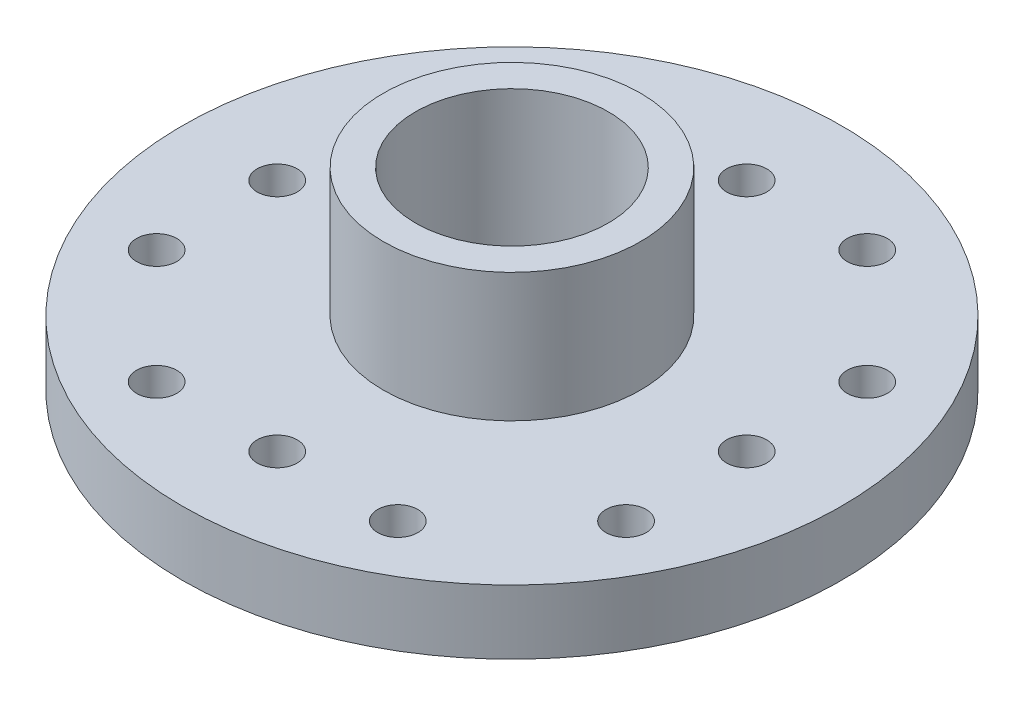
ISO-10303-21;
HEADER;
FILE_DESCRIPTION(('STEP AP214'),'2;1');
FILE_NAME('part.step','',(''),(''),'','','');
FILE_SCHEMA(('AUTOMOTIVE_DESIGN { 1 0 10303 214 1 1 1 1 }'));
ENDSEC;
DATA;
#1=APPLICATION_CONTEXT('core data for automotive mechanical design processes');
#2=APPLICATION_PROTOCOL_DEFINITION('international standard','automotive_design',2000,#1);
#3=PRODUCT_CONTEXT('',#1,'mechanical');
#4=PRODUCT('Part','Part','',(#3));
#5=PRODUCT_RELATED_PRODUCT_CATEGORY('part','',(#4));
#6=PRODUCT_DEFINITION_FORMATION('','',#4);
#7=PRODUCT_DEFINITION_CONTEXT('part definition',#1,'design');
#8=PRODUCT_DEFINITION('design','',#6,#7);
#9=PRODUCT_DEFINITION_SHAPE('','',#8);
#10=(LENGTH_UNIT() NAMED_UNIT(*) SI_UNIT(.MILLI.,.METRE.));
#11=(NAMED_UNIT(*) PLANE_ANGLE_UNIT() SI_UNIT($,.RADIAN.));
#12=(NAMED_UNIT(*) SI_UNIT($,.STERADIAN.) SOLID_ANGLE_UNIT());
#13=UNCERTAINTY_MEASURE_WITH_UNIT(LENGTH_MEASURE(1.E-05),#10,'distance_accuracy_value','');
#14=(GEOMETRIC_REPRESENTATION_CONTEXT(3) GLOBAL_UNCERTAINTY_ASSIGNED_CONTEXT((#13)) GLOBAL_UNIT_ASSIGNED_CONTEXT((#10,
#11,#12)) REPRESENTATION_CONTEXT('',''));
#15=CARTESIAN_POINT('',(0.,0.,0.));
#16=DIRECTION('',(0.,0.,1.));
#17=DIRECTION('',(1.,0.,0.));
#18=AXIS2_PLACEMENT_3D('',#15,#16,#17);
#19=CARTESIAN_POINT('',(0.,2.,0.));
#20=DIRECTION('',(0.,1.,0.));
#21=DIRECTION('',(0.,0.,1.));
#22=AXIS2_PLACEMENT_3D('',#19,#20,#21);
#23=PLANE('',#22);
#24=CARTESIAN_POINT('',(3.75000000000008,2.,-7.29999999999996));
#25=DIRECTION('',(0.,1.,0.));
#26=DIRECTION('',(-1.,0.,0.));
#27=AXIS2_PLACEMENT_3D('',#24,#25,#26);
#28=CIRCLE('',#27,0.625);
#29=CARTESIAN_POINT('',(3.12500000000008,2.,-7.29999999999997));
#30=VERTEX_POINT('',#29);
#31=EDGE_CURVE('E125',#30,#30,#28,.T.);
#32=ORIENTED_EDGE('',*,*,#31,.F.);
#33=EDGE_LOOP('',(#32));
#34=FACE_BOUND('',#33,.T.);
#35=CARTESIAN_POINT('',(-3.74999999999992,2.,-7.30000000000004));
#36=DIRECTION('',(0.,1.,0.));
#37=DIRECTION('',(1.,0.,0.));
#38=AXIS2_PLACEMENT_3D('',#35,#36,#37);
#39=CIRCLE('',#38,0.625);
#40=CARTESIAN_POINT('',(-3.12499999999992,2.,-7.30000000000003));
#41=VERTEX_POINT('',#40);
#42=EDGE_CURVE('E119',#41,#41,#39,.T.);
#43=ORIENTED_EDGE('',*,*,#42,.F.);
#44=EDGE_LOOP('',(#43));
#45=FACE_BOUND('',#44,.T.);
#46=CARTESIAN_POINT('',(0.,2.,-7.3));
#47=DIRECTION('',(0.,1.,0.));
#48=DIRECTION('',(1.,0.,0.));
#49=AXIS2_PLACEMENT_3D('',#46,#47,#48);
#50=CIRCLE('',#49,0.625000000000001);
#51=CARTESIAN_POINT('',(0.625000000000078,2.,-7.29999999999999));
#52=VERTEX_POINT('',#51);
#53=EDGE_CURVE('E113',#52,#52,#50,.T.);
#54=ORIENTED_EDGE('',*,*,#53,.F.);
#55=EDGE_LOOP('',(#54));
#56=FACE_BOUND('',#55,.T.);
#57=CARTESIAN_POINT('',(-7.3,2.,-3.75));
#58=DIRECTION('',(0.,1.,0.));
#59=DIRECTION('',(0.,0.,1.));
#60=AXIS2_PLACEMENT_3D('',#57,#58,#59);
#61=CIRCLE('',#60,0.625);
#62=CARTESIAN_POINT('',(-7.3,2.,-3.125));
#63=VERTEX_POINT('',#62);
#64=EDGE_CURVE('E107',#63,#63,#61,.T.);
#65=ORIENTED_EDGE('',*,*,#64,.F.);
#66=EDGE_LOOP('',(#65));
#67=FACE_BOUND('',#66,.T.);
#68=CARTESIAN_POINT('',(-7.3,2.,3.75));
#69=DIRECTION('',(0.,1.,0.));
#70=DIRECTION('',(0.,0.,-1.));
#71=AXIS2_PLACEMENT_3D('',#68,#69,#70);
#72=CIRCLE('',#71,0.625);
#73=CARTESIAN_POINT('',(-7.3,2.,3.125));
#74=VERTEX_POINT('',#73);
#75=EDGE_CURVE('E101',#74,#74,#72,.T.);
#76=ORIENTED_EDGE('',*,*,#75,.F.);
#77=EDGE_LOOP('',(#76));
#78=FACE_BOUND('',#77,.T.);
#79=CARTESIAN_POINT('',(-7.3,2.,0.));
#80=DIRECTION('',(0.,1.,0.));
#81=DIRECTION('',(0.,0.,-1.));
#82=AXIS2_PLACEMENT_3D('',#79,#80,#81);
#83=CIRCLE('',#82,0.625000000000001);
#84=CARTESIAN_POINT('',(-7.3,2.,-0.625000000000001));
#85=VERTEX_POINT('',#84);
#86=EDGE_CURVE('E95',#85,#85,#83,.T.);
#87=ORIENTED_EDGE('',*,*,#86,.F.);
#88=EDGE_LOOP('',(#87));
#89=FACE_BOUND('',#88,.T.);
#90=CARTESIAN_POINT('',(-3.75000000000003,2.,7.29999999999999));
#91=DIRECTION('',(0.,1.,0.));
#92=DIRECTION('',(1.,0.,0.));
#93=AXIS2_PLACEMENT_3D('',#90,#91,#92);
#94=CIRCLE('',#93,0.625);
#95=CARTESIAN_POINT('',(-3.12500000000003,2.,7.29999999999999));
#96=VERTEX_POINT('',#95);
#97=EDGE_CURVE('E89',#96,#96,#94,.T.);
#98=ORIENTED_EDGE('',*,*,#97,.F.);
#99=EDGE_LOOP('',(#98));
#100=FACE_BOUND('',#99,.T.);
#101=CARTESIAN_POINT('',(3.74999999999997,2.,7.30000000000001));
#102=DIRECTION('',(0.,1.,0.));
#103=DIRECTION('',(-1.,0.,0.));
#104=AXIS2_PLACEMENT_3D('',#101,#102,#103);
#105=CIRCLE('',#104,0.625);
#106=CARTESIAN_POINT('',(3.12499999999997,2.,7.30000000000001));
#107=VERTEX_POINT('',#106);
#108=EDGE_CURVE('E83',#107,#107,#105,.T.);
#109=ORIENTED_EDGE('',*,*,#108,.F.);
#110=EDGE_LOOP('',(#109));
#111=FACE_BOUND('',#110,.T.);
#112=CARTESIAN_POINT('',(0.,2.,7.3));
#113=DIRECTION('',(0.,1.,0.));
#114=DIRECTION('',(-1.,0.,0.));
#115=AXIS2_PLACEMENT_3D('',#112,#113,#114);
#116=CIRCLE('',#115,0.625000000000001);
#117=CARTESIAN_POINT('',(-0.625000000000027,2.,7.3));
#118=VERTEX_POINT('',#117);
#119=EDGE_CURVE('E77',#118,#118,#116,.T.);
#120=ORIENTED_EDGE('',*,*,#119,.F.);
#121=EDGE_LOOP('',(#120));
#122=FACE_BOUND('',#121,.T.);
#123=CARTESIAN_POINT('',(7.3,2.,3.75));
#124=DIRECTION('',(0.,1.,0.));
#125=DIRECTION('',(0.,0.,-1.));
#126=AXIS2_PLACEMENT_3D('',#123,#124,#125);
#127=CIRCLE('',#126,0.625);
#128=CARTESIAN_POINT('',(7.3,2.,3.125));
#129=VERTEX_POINT('',#128);
#130=EDGE_CURVE('E71',#129,#129,#127,.T.);
#131=ORIENTED_EDGE('',*,*,#130,.F.);
#132=EDGE_LOOP('',(#131));
#133=FACE_BOUND('',#132,.T.);
#134=CARTESIAN_POINT('',(7.3,2.,-3.75));
#135=DIRECTION('',(0.,1.,0.));
#136=DIRECTION('',(0.,0.,1.));
#137=AXIS2_PLACEMENT_3D('',#134,#135,#136);
#138=CIRCLE('',#137,0.625);
#139=CARTESIAN_POINT('',(7.3,2.,-3.125));
#140=VERTEX_POINT('',#139);
#141=EDGE_CURVE('E65',#140,#140,#138,.T.);
#142=ORIENTED_EDGE('',*,*,#141,.F.);
#143=EDGE_LOOP('',(#142));
#144=FACE_BOUND('',#143,.T.);
#145=CARTESIAN_POINT('',(7.3,2.,0.));
#146=DIRECTION('',(0.,1.,0.));
#147=DIRECTION('',(0.,0.,1.));
#148=AXIS2_PLACEMENT_3D('',#145,#146,#147);
#149=CIRCLE('',#148,0.625000000000001);
#150=CARTESIAN_POINT('',(7.3,2.,0.625000000000001));
#151=VERTEX_POINT('',#150);
#152=EDGE_CURVE('E59',#151,#151,#149,.T.);
#153=ORIENTED_EDGE('',*,*,#152,.F.);
#154=EDGE_LOOP('',(#153));
#155=FACE_BOUND('',#154,.T.);
#156=CARTESIAN_POINT('',(0.,2.,0.));
#157=DIRECTION('',(0.,1.,0.));
#158=DIRECTION('',(0.,0.,1.));
#159=AXIS2_PLACEMENT_3D('',#156,#157,#158);
#160=CIRCLE('',#159,10.25);
#161=CARTESIAN_POINT('',(0.,2.,10.25));
#162=VERTEX_POINT('',#161);
#163=EDGE_CURVE('E10',#162,#162,#160,.T.);
#164=ORIENTED_EDGE('',*,*,#163,.T.);
#165=EDGE_LOOP('',(#164));
#166=FACE_BOUND('',#165,.T.);
#167=CARTESIAN_POINT('',(0.,2.,0.));
#168=DIRECTION('',(0.,1.,0.));
#169=DIRECTION('',(0.,0.,1.));
#170=AXIS2_PLACEMENT_3D('',#167,#168,#169);
#171=CIRCLE('',#170,4.);
#172=CARTESIAN_POINT('',(0.,2.,4.));
#173=VERTEX_POINT('',#172);
#174=EDGE_CURVE('E48',#173,#173,#171,.T.);
#175=ORIENTED_EDGE('',*,*,#174,.F.);
#176=EDGE_LOOP('',(#175));
#177=FACE_BOUND('',#176,.T.);
#178=ADVANCED_FACE('F32',(#34,#45,#56,#67,#78,#89,#100,#111,#122,#133,#144,#155,#166,#177),#23,.T.);
#179=CARTESIAN_POINT('',(0.,0.,0.));
#180=DIRECTION('',(0.,1.,0.));
#181=DIRECTION('',(0.,0.,1.));
#182=AXIS2_PLACEMENT_3D('',#179,#180,#181);
#183=PLANE('',#182);
#184=CARTESIAN_POINT('',(3.75000000000008,0.,-7.29999999999996));
#185=DIRECTION('',(0.,1.,0.));
#186=DIRECTION('',(0.,0.,1.));
#187=AXIS2_PLACEMENT_3D('',#184,#185,#186);
#188=CIRCLE('',#187,0.625);
#189=CARTESIAN_POINT('',(3.75000000000008,0.,-6.67499999999996));
#190=VERTEX_POINT('',#189);
#191=EDGE_CURVE('E122',#190,#190,#188,.F.);
#192=ORIENTED_EDGE('',*,*,#191,.F.);
#193=EDGE_LOOP('',(#192));
#194=FACE_BOUND('',#193,.T.);
#195=CARTESIAN_POINT('',(-3.74999999999992,0.,-7.30000000000004));
#196=DIRECTION('',(0.,1.,0.));
#197=DIRECTION('',(0.,0.,1.));
#198=AXIS2_PLACEMENT_3D('',#195,#196,#197);
#199=CIRCLE('',#198,0.625);
#200=CARTESIAN_POINT('',(-3.74999999999992,0.,-6.67500000000004));
#201=VERTEX_POINT('',#200);
#202=EDGE_CURVE('E116',#201,#201,#199,.F.);
#203=ORIENTED_EDGE('',*,*,#202,.F.);
#204=EDGE_LOOP('',(#203));
#205=FACE_BOUND('',#204,.T.);
#206=CARTESIAN_POINT('',(0.,0.,-7.3));
#207=DIRECTION('',(0.,1.,0.));
#208=DIRECTION('',(0.,0.,1.));
#209=AXIS2_PLACEMENT_3D('',#206,#207,#208);
#210=CIRCLE('',#209,0.625000000000001);
#211=CARTESIAN_POINT('',(0.,0.,-6.675));
#212=VERTEX_POINT('',#211);
#213=EDGE_CURVE('E110',#212,#212,#210,.F.);
#214=ORIENTED_EDGE('',*,*,#213,.F.);
#215=EDGE_LOOP('',(#214));
#216=FACE_BOUND('',#215,.T.);
#217=CARTESIAN_POINT('',(-7.3,0.,-3.75));
#218=DIRECTION('',(0.,1.,0.));
#219=DIRECTION('',(0.,0.,1.));
#220=AXIS2_PLACEMENT_3D('',#217,#218,#219);
#221=CIRCLE('',#220,0.625);
#222=CARTESIAN_POINT('',(-7.3,0.,-3.125));
#223=VERTEX_POINT('',#222);
#224=EDGE_CURVE('E104',#223,#223,#221,.F.);
#225=ORIENTED_EDGE('',*,*,#224,.F.);
#226=EDGE_LOOP('',(#225));
#227=FACE_BOUND('',#226,.T.);
#228=CARTESIAN_POINT('',(-7.3,0.,3.75));
#229=DIRECTION('',(0.,1.,0.));
#230=DIRECTION('',(0.,0.,1.));
#231=AXIS2_PLACEMENT_3D('',#228,#229,#230);
#232=CIRCLE('',#231,0.625);
#233=CARTESIAN_POINT('',(-7.3,0.,4.375));
#234=VERTEX_POINT('',#233);
#235=EDGE_CURVE('E98',#234,#234,#232,.F.);
#236=ORIENTED_EDGE('',*,*,#235,.F.);
#237=EDGE_LOOP('',(#236));
#238=FACE_BOUND('',#237,.T.);
#239=CARTESIAN_POINT('',(-7.3,0.,0.));
#240=DIRECTION('',(0.,1.,0.));
#241=DIRECTION('',(0.,0.,1.));
#242=AXIS2_PLACEMENT_3D('',#239,#240,#241);
#243=CIRCLE('',#242,0.625000000000001);
#244=CARTESIAN_POINT('',(-7.3,0.,0.625000000000001));
#245=VERTEX_POINT('',#244);
#246=EDGE_CURVE('E92',#245,#245,#243,.F.);
#247=ORIENTED_EDGE('',*,*,#246,.F.);
#248=EDGE_LOOP('',(#247));
#249=FACE_BOUND('',#248,.T.);
#250=CARTESIAN_POINT('',(-3.75000000000003,0.,7.29999999999999));
#251=DIRECTION('',(0.,1.,0.));
#252=DIRECTION('',(0.,0.,1.));
#253=AXIS2_PLACEMENT_3D('',#250,#251,#252);
#254=CIRCLE('',#253,0.625);
#255=CARTESIAN_POINT('',(-3.75000000000003,0.,7.92499999999999));
#256=VERTEX_POINT('',#255);
#257=EDGE_CURVE('E86',#256,#256,#254,.F.);
#258=ORIENTED_EDGE('',*,*,#257,.F.);
#259=EDGE_LOOP('',(#258));
#260=FACE_BOUND('',#259,.T.);
#261=CARTESIAN_POINT('',(3.74999999999997,0.,7.30000000000001));
#262=DIRECTION('',(0.,1.,0.));
#263=DIRECTION('',(0.,0.,1.));
#264=AXIS2_PLACEMENT_3D('',#261,#262,#263);
#265=CIRCLE('',#264,0.625);
#266=CARTESIAN_POINT('',(3.74999999999997,0.,7.92500000000001));
#267=VERTEX_POINT('',#266);
#268=EDGE_CURVE('E80',#267,#267,#265,.F.);
#269=ORIENTED_EDGE('',*,*,#268,.F.);
#270=EDGE_LOOP('',(#269));
#271=FACE_BOUND('',#270,.T.);
#272=CARTESIAN_POINT('',(0.,0.,7.3));
#273=DIRECTION('',(0.,1.,0.));
#274=DIRECTION('',(0.,0.,1.));
#275=AXIS2_PLACEMENT_3D('',#272,#273,#274);
#276=CIRCLE('',#275,0.625000000000001);
#277=CARTESIAN_POINT('',(0.,0.,7.925));
#278=VERTEX_POINT('',#277);
#279=EDGE_CURVE('E74',#278,#278,#276,.F.);
#280=ORIENTED_EDGE('',*,*,#279,.F.);
#281=EDGE_LOOP('',(#280));
#282=FACE_BOUND('',#281,.T.);
#283=CARTESIAN_POINT('',(7.3,0.,3.75));
#284=DIRECTION('',(0.,1.,0.));
#285=DIRECTION('',(0.,0.,1.));
#286=AXIS2_PLACEMENT_3D('',#283,#284,#285);
#287=CIRCLE('',#286,0.625);
#288=CARTESIAN_POINT('',(7.3,0.,4.375));
#289=VERTEX_POINT('',#288);
#290=EDGE_CURVE('E68',#289,#289,#287,.F.);
#291=ORIENTED_EDGE('',*,*,#290,.F.);
#292=EDGE_LOOP('',(#291));
#293=FACE_BOUND('',#292,.T.);
#294=CARTESIAN_POINT('',(7.3,0.,-3.75));
#295=DIRECTION('',(0.,1.,0.));
#296=DIRECTION('',(0.,0.,1.));
#297=AXIS2_PLACEMENT_3D('',#294,#295,#296);
#298=CIRCLE('',#297,0.625);
#299=CARTESIAN_POINT('',(7.3,0.,-3.125));
#300=VERTEX_POINT('',#299);
#301=EDGE_CURVE('E62',#300,#300,#298,.F.);
#302=ORIENTED_EDGE('',*,*,#301,.F.);
#303=EDGE_LOOP('',(#302));
#304=FACE_BOUND('',#303,.T.);
#305=CARTESIAN_POINT('',(7.3,0.,0.));
#306=DIRECTION('',(0.,1.,0.));
#307=DIRECTION('',(0.,0.,1.));
#308=AXIS2_PLACEMENT_3D('',#305,#306,#307);
#309=CIRCLE('',#308,0.625000000000001);
#310=CARTESIAN_POINT('',(7.3,0.,0.625000000000001));
#311=VERTEX_POINT('',#310);
#312=EDGE_CURVE('E56',#311,#311,#309,.F.);
#313=ORIENTED_EDGE('',*,*,#312,.F.);
#314=EDGE_LOOP('',(#313));
#315=FACE_BOUND('',#314,.T.);
#316=CARTESIAN_POINT('',(0.,0.,0.));
#317=DIRECTION('',(0.,1.,0.));
#318=DIRECTION('',(0.,0.,1.));
#319=AXIS2_PLACEMENT_3D('',#316,#317,#318);
#320=CIRCLE('',#319,10.25);
#321=CARTESIAN_POINT('',(0.,0.,10.25));
#322=VERTEX_POINT('',#321);
#323=EDGE_CURVE('E36',#322,#322,#320,.T.);
#324=ORIENTED_EDGE('',*,*,#323,.F.);
#325=EDGE_LOOP('',(#324));
#326=FACE_BOUND('',#325,.T.);
#327=CARTESIAN_POINT('',(0.,0.,0.));
#328=DIRECTION('',(0.,1.,0.));
#329=DIRECTION('',(0.,0.,1.));
#330=AXIS2_PLACEMENT_3D('',#327,#328,#329);
#331=CIRCLE('',#330,3.);
#332=CARTESIAN_POINT('',(0.,0.,3.));
#333=VERTEX_POINT('',#332);
#334=EDGE_CURVE('E43',#333,#333,#331,.T.);
#335=ORIENTED_EDGE('',*,*,#334,.T.);
#336=EDGE_LOOP('',(#335));
#337=FACE_BOUND('',#336,.T.);
#338=ADVANCED_FACE('F134',(#194,#205,#216,#227,#238,#249,#260,#271,#282,#293,#304,#315,#326,
#337),#183,.F.);
#339=CARTESIAN_POINT('',(0.,2.,0.));
#340=DIRECTION('',(0.,-1.,0.));
#341=DIRECTION('',(0.,0.,-1.));
#342=AXIS2_PLACEMENT_3D('',#339,#340,#341);
#343=CYLINDRICAL_SURFACE('',#342,10.25);
#344=ORIENTED_EDGE('',*,*,#163,.F.);
#345=EDGE_LOOP('',(#344));
#346=FACE_BOUND('',#345,.T.);
#347=ORIENTED_EDGE('',*,*,#323,.T.);
#348=EDGE_LOOP('',(#347));
#349=FACE_BOUND('',#348,.T.);
#350=ADVANCED_FACE('F34',(#346,#349),#343,.T.);
#351=CARTESIAN_POINT('',(0.,2.,0.));
#352=DIRECTION('',(0.,-1.,0.));
#353=DIRECTION('',(0.,0.,-1.));
#354=AXIS2_PLACEMENT_3D('',#351,#352,#353);
#355=CYLINDRICAL_SURFACE('',#354,3.);
#356=ORIENTED_EDGE('',*,*,#334,.F.);
#357=EDGE_LOOP('',(#356));
#358=FACE_BOUND('',#357,.T.);
#359=CARTESIAN_POINT('',(0.,6.,0.));
#360=DIRECTION('',(0.,1.,0.));
#361=DIRECTION('',(0.,0.,1.));
#362=AXIS2_PLACEMENT_3D('',#359,#360,#361);
#363=CIRCLE('',#362,3.);
#364=CARTESIAN_POINT('',(0.,6.,3.));
#365=VERTEX_POINT('',#364);
#366=EDGE_CURVE('E51',#365,#365,#363,.T.);
#367=ORIENTED_EDGE('',*,*,#366,.T.);
#368=EDGE_LOOP('',(#367));
#369=FACE_BOUND('',#368,.T.);
#370=ADVANCED_FACE('F173',(#358,#369),#355,.F.);
#371=CARTESIAN_POINT('',(0.,6.,0.));
#372=DIRECTION('',(0.,1.,0.));
#373=DIRECTION('',(0.,0.,1.));
#374=AXIS2_PLACEMENT_3D('',#371,#372,#373);
#375=PLANE('',#374);
#376=CARTESIAN_POINT('',(0.,6.,0.));
#377=DIRECTION('',(0.,1.,0.));
#378=DIRECTION('',(0.,0.,1.));
#379=AXIS2_PLACEMENT_3D('',#376,#377,#378);
#380=CIRCLE('',#379,4.);
#381=CARTESIAN_POINT('',(0.,6.,4.));
#382=VERTEX_POINT('',#381);
#383=EDGE_CURVE('E47',#382,#382,#380,.T.);
#384=ORIENTED_EDGE('',*,*,#383,.T.);
#385=EDGE_LOOP('',(#384));
#386=FACE_BOUND('',#385,.T.);
#387=ORIENTED_EDGE('',*,*,#366,.F.);
#388=EDGE_LOOP('',(#387));
#389=FACE_BOUND('',#388,.T.);
#390=ADVANCED_FACE('F163',(#386,#389),#375,.T.);
#391=CARTESIAN_POINT('',(0.,6.,0.));
#392=DIRECTION('',(0.,-1.,0.));
#393=DIRECTION('',(0.,0.,-1.));
#394=AXIS2_PLACEMENT_3D('',#391,#392,#393);
#395=CYLINDRICAL_SURFACE('',#394,4.);
#396=ORIENTED_EDGE('',*,*,#383,.F.);
#397=EDGE_LOOP('',(#396));
#398=FACE_BOUND('',#397,.T.);
#399=ORIENTED_EDGE('',*,*,#174,.T.);
#400=EDGE_LOOP('',(#399));
#401=FACE_BOUND('',#400,.T.);
#402=ADVANCED_FACE('F160',(#398,#401),#395,.T.);
#403=CARTESIAN_POINT('',(7.3,-0.00100000000000013,0.));
#404=DIRECTION('',(0.,1.,0.));
#405=DIRECTION('',(0.,0.,1.));
#406=AXIS2_PLACEMENT_3D('',#403,#404,#405);
#407=CYLINDRICAL_SURFACE('',#406,0.625000000000001);
#408=ORIENTED_EDGE('',*,*,#152,.T.);
#409=EDGE_LOOP('',(#408));
#410=FACE_BOUND('',#409,.T.);
#411=ORIENTED_EDGE('',*,*,#312,.T.);
#412=EDGE_LOOP('',(#411));
#413=FACE_BOUND('',#412,.T.);
#414=ADVANCED_FACE('F162',(#410,#413),#407,.F.);
#415=CARTESIAN_POINT('',(7.3,-0.00100000000000013,-3.75));
#416=DIRECTION('',(0.,1.,0.));
#417=DIRECTION('',(0.,0.,1.));
#418=AXIS2_PLACEMENT_3D('',#415,#416,#417);
#419=CYLINDRICAL_SURFACE('',#418,0.625);
#420=ORIENTED_EDGE('',*,*,#141,.T.);
#421=EDGE_LOOP('',(#420));
#422=FACE_BOUND('',#421,.T.);
#423=ORIENTED_EDGE('',*,*,#301,.T.);
#424=EDGE_LOOP('',(#423));
#425=FACE_BOUND('',#424,.T.);
#426=ADVANCED_FACE('F170',(#422,#425),#419,.F.);
#427=CARTESIAN_POINT('',(7.3,-0.00100000000000013,3.75));
#428=DIRECTION('',(0.,1.,0.));
#429=DIRECTION('',(0.,0.,1.));
#430=AXIS2_PLACEMENT_3D('',#427,#428,#429);
#431=CYLINDRICAL_SURFACE('',#430,0.625);
#432=ORIENTED_EDGE('',*,*,#130,.T.);
#433=EDGE_LOOP('',(#432));
#434=FACE_BOUND('',#433,.T.);
#435=ORIENTED_EDGE('',*,*,#290,.T.);
#436=EDGE_LOOP('',(#435));
#437=FACE_BOUND('',#436,.T.);
#438=ADVANCED_FACE('F220',(#434,#437),#431,.F.);
#439=CARTESIAN_POINT('',(0.,-0.00100000000000013,7.3));
#440=DIRECTION('',(0.,1.,0.));
#441=DIRECTION('',(0.,0.,1.));
#442=AXIS2_PLACEMENT_3D('',#439,#440,#441);
#443=CYLINDRICAL_SURFACE('',#442,0.625000000000001);
#444=ORIENTED_EDGE('',*,*,#119,.T.);
#445=EDGE_LOOP('',(#444));
#446=FACE_BOUND('',#445,.T.);
#447=ORIENTED_EDGE('',*,*,#279,.T.);
#448=EDGE_LOOP('',(#447));
#449=FACE_BOUND('',#448,.T.);
#450=ADVANCED_FACE('F226',(#446,#449),#443,.F.);
#451=CARTESIAN_POINT('',(3.74999999999997,-0.00100000000000013,7.30000000000001));
#452=DIRECTION('',(0.,1.,0.));
#453=DIRECTION('',(0.,0.,1.));
#454=AXIS2_PLACEMENT_3D('',#451,#452,#453);
#455=CYLINDRICAL_SURFACE('',#454,0.625);
#456=ORIENTED_EDGE('',*,*,#108,.T.);
#457=EDGE_LOOP('',(#456));
#458=FACE_BOUND('',#457,.T.);
#459=ORIENTED_EDGE('',*,*,#268,.T.);
#460=EDGE_LOOP('',(#459));
#461=FACE_BOUND('',#460,.T.);
#462=ADVANCED_FACE('F232',(#458,#461),#455,.F.);
#463=CARTESIAN_POINT('',(-3.75000000000003,-0.00100000000000013,7.29999999999999));
#464=DIRECTION('',(0.,1.,0.));
#465=DIRECTION('',(0.,0.,1.));
#466=AXIS2_PLACEMENT_3D('',#463,#464,#465);
#467=CYLINDRICAL_SURFACE('',#466,0.625);
#468=ORIENTED_EDGE('',*,*,#97,.T.);
#469=EDGE_LOOP('',(#468));
#470=FACE_BOUND('',#469,.T.);
#471=ORIENTED_EDGE('',*,*,#257,.T.);
#472=EDGE_LOOP('',(#471));
#473=FACE_BOUND('',#472,.T.);
#474=ADVANCED_FACE('F236',(#470,#473),#467,.F.);
#475=CARTESIAN_POINT('',(-7.3,-0.00100000000000013,0.));
#476=DIRECTION('',(0.,1.,0.));
#477=DIRECTION('',(0.,0.,1.));
#478=AXIS2_PLACEMENT_3D('',#475,#476,#477);
#479=CYLINDRICAL_SURFACE('',#478,0.625000000000001);
#480=ORIENTED_EDGE('',*,*,#86,.T.);
#481=EDGE_LOOP('',(#480));
#482=FACE_BOUND('',#481,.T.);
#483=ORIENTED_EDGE('',*,*,#246,.T.);
#484=EDGE_LOOP('',(#483));
#485=FACE_BOUND('',#484,.T.);
#486=ADVANCED_FACE('F240',(#482,#485),#479,.F.);
#487=CARTESIAN_POINT('',(-7.3,-0.00100000000000013,3.75));
#488=DIRECTION('',(0.,1.,0.));
#489=DIRECTION('',(0.,0.,1.));
#490=AXIS2_PLACEMENT_3D('',#487,#488,#489);
#491=CYLINDRICAL_SURFACE('',#490,0.625);
#492=ORIENTED_EDGE('',*,*,#75,.T.);
#493=EDGE_LOOP('',(#492));
#494=FACE_BOUND('',#493,.T.);
#495=ORIENTED_EDGE('',*,*,#235,.T.);
#496=EDGE_LOOP('',(#495));
#497=FACE_BOUND('',#496,.T.);
#498=ADVANCED_FACE('F244',(#494,#497),#491,.F.);
#499=CARTESIAN_POINT('',(-7.3,-0.00100000000000013,-3.75));
#500=DIRECTION('',(0.,1.,0.));
#501=DIRECTION('',(0.,0.,1.));
#502=AXIS2_PLACEMENT_3D('',#499,#500,#501);
#503=CYLINDRICAL_SURFACE('',#502,0.625);
#504=ORIENTED_EDGE('',*,*,#64,.T.);
#505=EDGE_LOOP('',(#504));
#506=FACE_BOUND('',#505,.T.);
#507=ORIENTED_EDGE('',*,*,#224,.T.);
#508=EDGE_LOOP('',(#507));
#509=FACE_BOUND('',#508,.T.);
#510=ADVANCED_FACE('F248',(#506,#509),#503,.F.);
#511=CARTESIAN_POINT('',(0.,-0.00100000000000013,-7.3));
#512=DIRECTION('',(0.,1.,0.));
#513=DIRECTION('',(0.,0.,1.));
#514=AXIS2_PLACEMENT_3D('',#511,#512,#513);
#515=CYLINDRICAL_SURFACE('',#514,0.625000000000001);
#516=ORIENTED_EDGE('',*,*,#53,.T.);
#517=EDGE_LOOP('',(#516));
#518=FACE_BOUND('',#517,.T.);
#519=ORIENTED_EDGE('',*,*,#213,.T.);
#520=EDGE_LOOP('',(#519));
#521=FACE_BOUND('',#520,.T.);
#522=ADVANCED_FACE('F252',(#518,#521),#515,.F.);
#523=CARTESIAN_POINT('',(-3.74999999999992,-0.00100000000000013,-7.30000000000004));
#524=DIRECTION('',(0.,1.,0.));
#525=DIRECTION('',(0.,0.,1.));
#526=AXIS2_PLACEMENT_3D('',#523,#524,#525);
#527=CYLINDRICAL_SURFACE('',#526,0.625);
#528=ORIENTED_EDGE('',*,*,#42,.T.);
#529=EDGE_LOOP('',(#528));
#530=FACE_BOUND('',#529,.T.);
#531=ORIENTED_EDGE('',*,*,#202,.T.);
#532=EDGE_LOOP('',(#531));
#533=FACE_BOUND('',#532,.T.);
#534=ADVANCED_FACE('F256',(#530,#533),#527,.F.);
#535=CARTESIAN_POINT('',(3.75000000000008,-0.00100000000000013,-7.29999999999996));
#536=DIRECTION('',(0.,1.,0.));
#537=DIRECTION('',(0.,0.,1.));
#538=AXIS2_PLACEMENT_3D('',#535,#536,#537);
#539=CYLINDRICAL_SURFACE('',#538,0.625);
#540=ORIENTED_EDGE('',*,*,#31,.T.);
#541=EDGE_LOOP('',(#540));
#542=FACE_BOUND('',#541,.T.);
#543=ORIENTED_EDGE('',*,*,#191,.T.);
#544=EDGE_LOOP('',(#543));
#545=FACE_BOUND('',#544,.T.);
#546=ADVANCED_FACE('F129',(#542,#545),#539,.F.);
#547=CLOSED_SHELL('',(#178,#338,#350,#370,#390,#402,#414,#426,#438,#450,#462,#474,#486,#498,
#510,#522,#534,#546));
#548=MANIFOLD_SOLID_BREP('B2',#547);
#549=ADVANCED_BREP_SHAPE_REPRESENTATION('',(#18,#548),#14);
#550=SHAPE_DEFINITION_REPRESENTATION(#9,#549);
ENDSEC;
END-ISO-10303-21;
